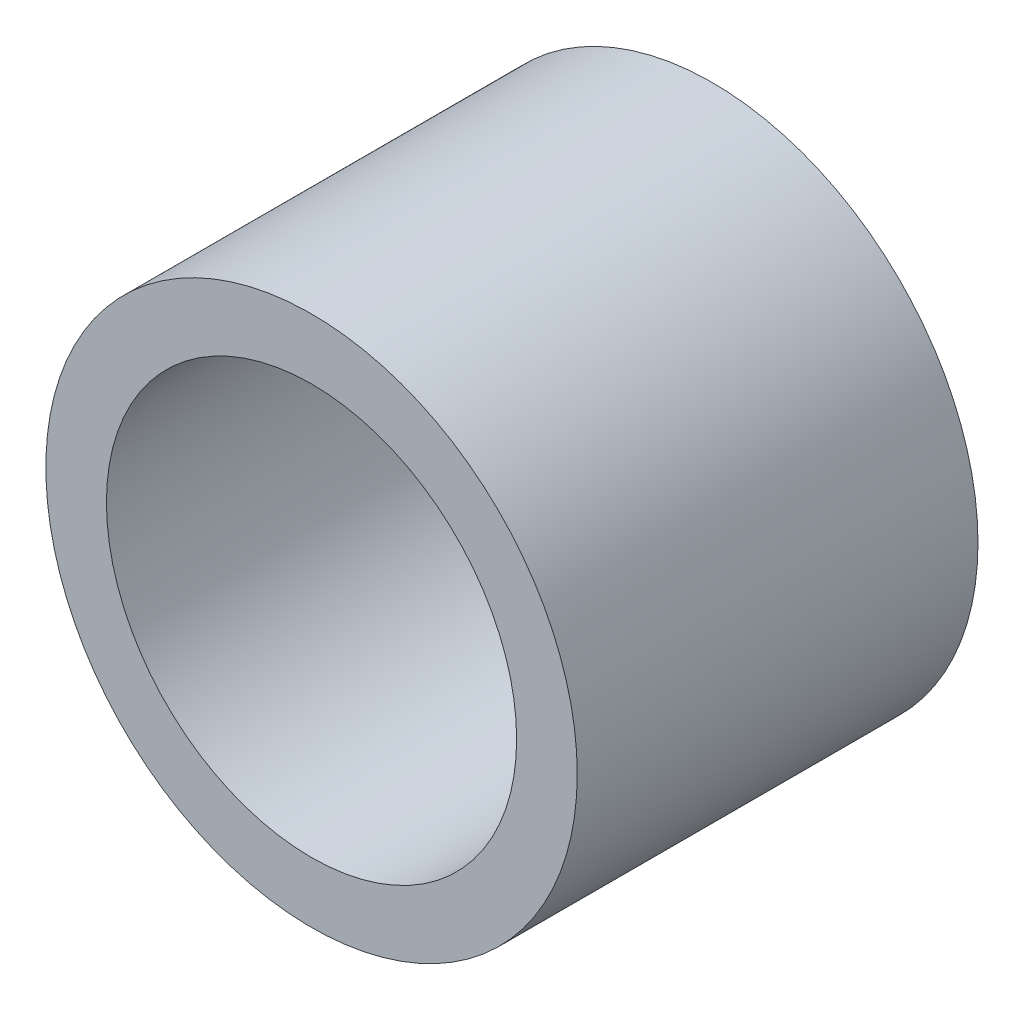
ISO-10303-21;
HEADER;
FILE_DESCRIPTION(('STEP AP214'),'2;1');
FILE_NAME('part.step','',(''),(''),'','','');
FILE_SCHEMA(('AUTOMOTIVE_DESIGN { 1 0 10303 214 1 1 1 1 }'));
ENDSEC;
DATA;
#1=APPLICATION_CONTEXT('core data for automotive mechanical design processes');
#2=APPLICATION_PROTOCOL_DEFINITION('international standard','automotive_design',2000,#1);
#3=PRODUCT_CONTEXT('',#1,'mechanical');
#4=PRODUCT('Part','Part','',(#3));
#5=PRODUCT_RELATED_PRODUCT_CATEGORY('part','',(#4));
#6=PRODUCT_DEFINITION_FORMATION('','',#4);
#7=PRODUCT_DEFINITION_CONTEXT('part definition',#1,'design');
#8=PRODUCT_DEFINITION('design','',#6,#7);
#9=PRODUCT_DEFINITION_SHAPE('','',#8);
#10=(LENGTH_UNIT() NAMED_UNIT(*) SI_UNIT(.MILLI.,.METRE.));
#11=(NAMED_UNIT(*) PLANE_ANGLE_UNIT() SI_UNIT($,.RADIAN.));
#12=(NAMED_UNIT(*) SI_UNIT($,.STERADIAN.) SOLID_ANGLE_UNIT());
#13=UNCERTAINTY_MEASURE_WITH_UNIT(LENGTH_MEASURE(1.E-05),#10,'distance_accuracy_value','');
#14=(GEOMETRIC_REPRESENTATION_CONTEXT(3) GLOBAL_UNCERTAINTY_ASSIGNED_CONTEXT((#13)) GLOBAL_UNIT_ASSIGNED_CONTEXT((#10,
#11,#12)) REPRESENTATION_CONTEXT('',''));
#15=CARTESIAN_POINT('',(0.,0.,0.));
#16=DIRECTION('',(0.,0.,1.));
#17=DIRECTION('',(1.,0.,0.));
#18=AXIS2_PLACEMENT_3D('',#15,#16,#17);
#19=CARTESIAN_POINT('',(0.,0.,-29.4));
#20=CARTESIAN_POINT('',(8.6788854935362,0.,-28.5546635201504));
#21=CARTESIAN_POINT('',(16.8412480468419,0.,-25.4));
#22=B_SPLINE_CURVE_WITH_KNOTS('',2,(#19,#20,#21),.UNSPECIFIED.,.F.,.F.,(3,3),(0.,1.),.UNSPECIFIED.);
#23=CARTESIAN_POINT('',(0.,0.,0.));
#24=DIRECTION('',(0.,0.,1.));
#25=AXIS1_PLACEMENT('',#23,#24);
#26=SURFACE_OF_REVOLUTION('',#22,#25);
#27=CARTESIAN_POINT('',(0.,0.,-25.4));
#28=DIRECTION('',(0.,0.,1.));
#29=DIRECTION('',(1.,0.,0.));
#30=AXIS2_PLACEMENT_3D('',#27,#28,#29);
#31=CIRCLE('',#30,16.8412480468419);
#32=CARTESIAN_POINT('',(16.8412480468419,0.,-25.4));
#33=VERTEX_POINT('',#32);
#34=EDGE_CURVE('E66',#33,#33,#31,.T.);
#35=ORIENTED_EDGE('',*,*,#34,.F.);
#36=EDGE_LOOP('',(#35));
#37=FACE_BOUND('',#36,.T.);
#38=CARTESIAN_POINT('',(0.,0.,-29.4));
#39=VERTEX_POINT('',#38);
#40=VERTEX_LOOP('',#39);
#41=FACE_BOUND('',#40,.T.);
#42=ADVANCED_FACE('F41',(#37,#41),#26,.T.);
#43=CARTESIAN_POINT('',(0.,0.,-28.9895002869275));
#44=CARTESIAN_POINT('',(6.52400677846745,0.,-26.4455523728564));
#45=CARTESIAN_POINT('',(13.,0.,-23.781740617491));
#46=B_SPLINE_CURVE_WITH_KNOTS('',2,(#43,#44,#45),.UNSPECIFIED.,.F.,.F.,(3,3),(0.,1.),.UNSPECIFIED.);
#47=CARTESIAN_POINT('',(0.,0.,0.));
#48=DIRECTION('',(0.,0.,1.));
#49=AXIS1_PLACEMENT('',#47,#48);
#50=SURFACE_OF_REVOLUTION('',#46,#49);
#51=CARTESIAN_POINT('',(0.,0.,-23.781740617491));
#52=DIRECTION('',(0.,0.,1.));
#53=DIRECTION('',(1.,0.,0.));
#54=AXIS2_PLACEMENT_3D('',#51,#52,#53);
#55=CIRCLE('',#54,13.);
#56=CARTESIAN_POINT('',(13.,0.,-23.781740617491));
#57=VERTEX_POINT('',#56);
#58=EDGE_CURVE('E11',#57,#57,#55,.T.);
#59=ORIENTED_EDGE('',*,*,#58,.T.);
#60=EDGE_LOOP('',(#59));
#61=FACE_BOUND('',#60,.T.);
#62=CARTESIAN_POINT('',(0.,0.,-28.9895002869275));
#63=VERTEX_POINT('',#62);
#64=VERTEX_LOOP('',#63);
#65=FACE_BOUND('',#64,.T.);
#66=ADVANCED_FACE('F57',(#61,#65),#50,.F.);
#67=CARTESIAN_POINT('',(0.,0.,0.));
#68=DIRECTION('',(0.,0.,1.));
#69=DIRECTION('',(1.,0.,0.));
#70=AXIS2_PLACEMENT_3D('',#67,#68,#69);
#71=CYLINDRICAL_SURFACE('',#70,13.);
#72=ORIENTED_EDGE('',*,*,#58,.F.);
#73=EDGE_LOOP('',(#72));
#74=FACE_BOUND('',#73,.T.);
#75=CARTESIAN_POINT('',(0.,0.,0.));
#76=DIRECTION('',(0.,0.,1.));
#77=DIRECTION('',(1.,0.,0.));
#78=AXIS2_PLACEMENT_3D('',#75,#76,#77);
#79=CIRCLE('',#78,13.);
#80=CARTESIAN_POINT('',(13.,0.,0.));
#81=VERTEX_POINT('',#80);
#82=EDGE_CURVE('E50',#81,#81,#79,.T.);
#83=ORIENTED_EDGE('',*,*,#82,.T.);
#84=EDGE_LOOP('',(#83));
#85=FACE_BOUND('',#84,.T.);
#86=ADVANCED_FACE('F62',(#74,#85),#71,.F.);
#87=CARTESIAN_POINT('',(0.,0.,0.));
#88=DIRECTION('',(0.,0.,1.));
#89=DIRECTION('',(1.,0.,0.));
#90=AXIS2_PLACEMENT_3D('',#87,#88,#89);
#91=PLANE('',#90);
#92=CARTESIAN_POINT('',(0.,0.,0.));
#93=DIRECTION('',(0.,0.,1.));
#94=DIRECTION('',(1.,0.,0.));
#95=AXIS2_PLACEMENT_3D('',#92,#93,#94);
#96=CIRCLE('',#95,16.8412480468419);
#97=CARTESIAN_POINT('',(16.8412480468419,0.,0.));
#98=VERTEX_POINT('',#97);
#99=EDGE_CURVE('E69',#98,#98,#96,.T.);
#100=ORIENTED_EDGE('',*,*,#99,.T.);
#101=EDGE_LOOP('',(#100));
#102=FACE_BOUND('',#101,.T.);
#103=ORIENTED_EDGE('',*,*,#82,.F.);
#104=EDGE_LOOP('',(#103));
#105=FACE_BOUND('',#104,.T.);
#106=ADVANCED_FACE('F83',(#102,#105),#91,.T.);
#107=CARTESIAN_POINT('',(0.,0.,0.));
#108=DIRECTION('',(0.,0.,1.));
#109=DIRECTION('',(1.,0.,0.));
#110=AXIS2_PLACEMENT_3D('',#107,#108,#109);
#111=CYLINDRICAL_SURFACE('',#110,16.8412480468419);
#112=ORIENTED_EDGE('',*,*,#34,.T.);
#113=EDGE_LOOP('',(#112));
#114=FACE_BOUND('',#113,.T.);
#115=ORIENTED_EDGE('',*,*,#99,.F.);
#116=EDGE_LOOP('',(#115));
#117=FACE_BOUND('',#116,.T.);
#118=ADVANCED_FACE('F85',(#114,#117),#111,.T.);
#119=CLOSED_SHELL('',(#42,#66,#86,#106,#118));
#120=MANIFOLD_SOLID_BREP('B2',#119);
#121=ADVANCED_BREP_SHAPE_REPRESENTATION('',(#18,#120),#14);
#122=SHAPE_DEFINITION_REPRESENTATION(#9,#121);
ENDSEC;
END-ISO-10303-21;
